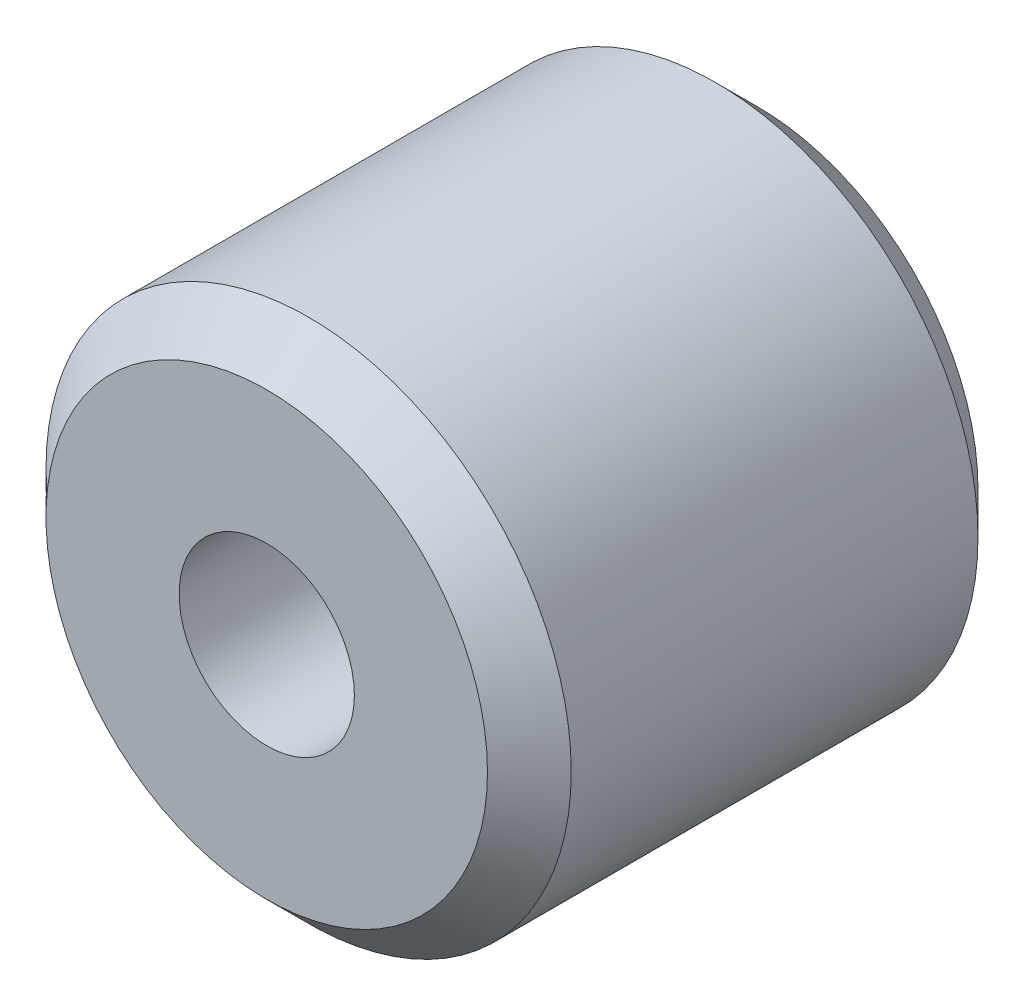
ISO-10303-21;
HEADER;
FILE_DESCRIPTION(('STEP AP214'),'2;1');
FILE_NAME('part.step','',(''),(''),'','','');
FILE_SCHEMA(('AUTOMOTIVE_DESIGN { 1 0 10303 214 1 1 1 1 }'));
ENDSEC;
DATA;
#1=APPLICATION_CONTEXT('core data for automotive mechanical design processes');
#2=APPLICATION_PROTOCOL_DEFINITION('international standard','automotive_design',2000,#1);
#3=PRODUCT_CONTEXT('',#1,'mechanical');
#4=PRODUCT('Part','Part','',(#3));
#5=PRODUCT_RELATED_PRODUCT_CATEGORY('part','',(#4));
#6=PRODUCT_DEFINITION_FORMATION('','',#4);
#7=PRODUCT_DEFINITION_CONTEXT('part definition',#1,'design');
#8=PRODUCT_DEFINITION('design','',#6,#7);
#9=PRODUCT_DEFINITION_SHAPE('','',#8);
#10=(LENGTH_UNIT() NAMED_UNIT(*) SI_UNIT(.MILLI.,.METRE.));
#11=(NAMED_UNIT(*) PLANE_ANGLE_UNIT() SI_UNIT($,.RADIAN.));
#12=(NAMED_UNIT(*) SI_UNIT($,.STERADIAN.) SOLID_ANGLE_UNIT());
#13=UNCERTAINTY_MEASURE_WITH_UNIT(LENGTH_MEASURE(1.E-05),#10,'distance_accuracy_value','');
#14=(GEOMETRIC_REPRESENTATION_CONTEXT(3) GLOBAL_UNCERTAINTY_ASSIGNED_CONTEXT((#13)) GLOBAL_UNIT_ASSIGNED_CONTEXT((#10,
#11,#12)) REPRESENTATION_CONTEXT('',''));
#15=CARTESIAN_POINT('',(0.,0.,0.));
#16=DIRECTION('',(0.,0.,1.));
#17=DIRECTION('',(1.,0.,0.));
#18=AXIS2_PLACEMENT_3D('',#15,#16,#17);
#19=CARTESIAN_POINT('',(0.,0.,4.45));
#20=DIRECTION('',(0.,0.,1.));
#21=DIRECTION('',(1.,0.,0.));
#22=AXIS2_PLACEMENT_3D('',#19,#20,#21);
#23=PLANE('',#22);
#24=CARTESIAN_POINT('',(0.,0.,4.45));
#25=DIRECTION('',(0.,0.,1.));
#26=DIRECTION('',(1.,0.,0.));
#27=AXIS2_PLACEMENT_3D('',#24,#25,#26);
#28=CIRCLE('',#27,4.005);
#29=CARTESIAN_POINT('',(4.005,0.,4.45));
#30=VERTEX_POINT('',#29);
#31=EDGE_CURVE('E10',#30,#30,#28,.T.);
#32=ORIENTED_EDGE('',*,*,#31,.T.);
#33=EDGE_LOOP('',(#32));
#34=FACE_BOUND('',#33,.T.);
#35=CARTESIAN_POINT('',(0.,0.,4.45));
#36=DIRECTION('',(0.,0.,1.));
#37=DIRECTION('',(1.,0.,0.));
#38=AXIS2_PLACEMENT_3D('',#35,#36,#37);
#39=CIRCLE('',#38,1.59);
#40=CARTESIAN_POINT('',(1.59,0.,4.45));
#41=VERTEX_POINT('',#40);
#42=EDGE_CURVE('E53',#41,#41,#39,.T.);
#43=ORIENTED_EDGE('',*,*,#42,.F.);
#44=EDGE_LOOP('',(#43));
#45=FACE_BOUND('',#44,.T.);
#46=ADVANCED_FACE('F32',(#34,#45),#23,.T.);
#47=CARTESIAN_POINT('',(0.,0.,-4.45));
#48=DIRECTION('',(0.,0.,1.));
#49=DIRECTION('',(1.,0.,0.));
#50=AXIS2_PLACEMENT_3D('',#47,#48,#49);
#51=PLANE('',#50);
#52=CARTESIAN_POINT('',(0.,0.,-4.45));
#53=DIRECTION('',(0.,0.,1.));
#54=DIRECTION('',(1.,0.,0.));
#55=AXIS2_PLACEMENT_3D('',#52,#53,#54);
#56=CIRCLE('',#55,4.005);
#57=CARTESIAN_POINT('',(4.005,0.,-4.45));
#58=VERTEX_POINT('',#57);
#59=EDGE_CURVE('E40',#58,#58,#56,.F.);
#60=ORIENTED_EDGE('',*,*,#59,.T.);
#61=EDGE_LOOP('',(#60));
#62=FACE_BOUND('',#61,.T.);
#63=CARTESIAN_POINT('',(0.,0.,-4.45));
#64=DIRECTION('',(0.,0.,1.));
#65=DIRECTION('',(1.,0.,0.));
#66=AXIS2_PLACEMENT_3D('',#63,#64,#65);
#67=CIRCLE('',#66,1.59);
#68=CARTESIAN_POINT('',(1.59,0.,-4.45));
#69=VERTEX_POINT('',#68);
#70=EDGE_CURVE('E54',#69,#69,#67,.T.);
#71=ORIENTED_EDGE('',*,*,#70,.T.);
#72=EDGE_LOOP('',(#71));
#73=FACE_BOUND('',#72,.T.);
#74=ADVANCED_FACE('F64',(#62,#73),#51,.F.);
#75=CARTESIAN_POINT('',(0.,0.,4.45));
#76=DIRECTION('',(0.,0.,-1.));
#77=DIRECTION('',(-1.,0.,0.));
#78=AXIS2_PLACEMENT_3D('',#75,#76,#77);
#79=CYLINDRICAL_SURFACE('',#78,4.765);
#80=CARTESIAN_POINT('',(0.,0.,-3.69));
#81=DIRECTION('',(0.,0.,1.));
#82=DIRECTION('',(1.,0.,0.));
#83=AXIS2_PLACEMENT_3D('',#80,#81,#82);
#84=CIRCLE('',#83,4.765);
#85=CARTESIAN_POINT('',(4.765,0.,-3.69));
#86=VERTEX_POINT('',#85);
#87=EDGE_CURVE('E44',#86,#86,#84,.T.);
#88=ORIENTED_EDGE('',*,*,#87,.T.);
#89=EDGE_LOOP('',(#88));
#90=FACE_BOUND('',#89,.T.);
#91=CARTESIAN_POINT('',(0.,0.,3.69));
#92=DIRECTION('',(0.,0.,1.));
#93=DIRECTION('',(1.,0.,0.));
#94=AXIS2_PLACEMENT_3D('',#91,#92,#93);
#95=CIRCLE('',#94,4.765);
#96=CARTESIAN_POINT('',(4.765,0.,3.69));
#97=VERTEX_POINT('',#96);
#98=EDGE_CURVE('E48',#97,#97,#95,.F.);
#99=ORIENTED_EDGE('',*,*,#98,.T.);
#100=EDGE_LOOP('',(#99));
#101=FACE_BOUND('',#100,.T.);
#102=ADVANCED_FACE('F69',(#90,#101),#79,.T.);
#103=CARTESIAN_POINT('',(0.,0.,4.45));
#104=DIRECTION('',(0.,0.,-1.));
#105=DIRECTION('',(-1.,0.,0.));
#106=AXIS2_PLACEMENT_3D('',#103,#104,#105);
#107=CYLINDRICAL_SURFACE('',#106,1.59);
#108=ORIENTED_EDGE('',*,*,#42,.T.);
#109=EDGE_LOOP('',(#108));
#110=FACE_BOUND('',#109,.T.);
#111=ORIENTED_EDGE('',*,*,#70,.F.);
#112=EDGE_LOOP('',(#111));
#113=FACE_BOUND('',#112,.T.);
#114=ADVANCED_FACE('F60',(#110,#113),#107,.F.);
#115=CARTESIAN_POINT('',(0.,0.,-3.69));
#116=DIRECTION('',(0.,0.,1.));
#117=DIRECTION('',(1.,0.,0.));
#118=AXIS2_PLACEMENT_3D('',#115,#116,#117);
#119=CONICAL_SURFACE('',#118,4.765,0.785398163397448);
#120=CARTESIAN_POINT('',(4.005,0.,-4.45));
#121=CARTESIAN_POINT('',(4.01291666666666,0.,-4.44208333333333));
#122=CARTESIAN_POINT('',(4.02083333333333,0.,-4.43416666666667));
#123=CARTESIAN_POINT('',(4.03666666666666,0.,-4.41833333333333));
#124=CARTESIAN_POINT('',(4.04458333333333,0.,-4.41041666666667));
#125=CARTESIAN_POINT('',(4.06041666666666,0.,-4.39458333333333));
#126=CARTESIAN_POINT('',(4.06833333333333,0.,-4.38666666666667));
#127=CARTESIAN_POINT('',(4.08416666666666,0.,-4.37083333333333));
#128=CARTESIAN_POINT('',(4.09208333333333,0.,-4.36291666666667));
#129=CARTESIAN_POINT('',(4.10791666666666,0.,-4.34708333333333));
#130=CARTESIAN_POINT('',(4.11583333333333,0.,-4.33916666666667));
#131=CARTESIAN_POINT('',(4.13166666666666,0.,-4.32333333333333));
#132=CARTESIAN_POINT('',(4.13958333333333,0.,-4.31541666666667));
#133=CARTESIAN_POINT('',(4.15541666666666,0.,-4.29958333333333));
#134=CARTESIAN_POINT('',(4.16333333333333,0.,-4.29166666666667));
#135=CARTESIAN_POINT('',(4.17916666666666,0.,-4.27583333333333));
#136=CARTESIAN_POINT('',(4.18708333333333,0.,-4.26791666666667));
#137=CARTESIAN_POINT('',(4.20291666666666,0.,-4.25208333333333));
#138=CARTESIAN_POINT('',(4.21083333333333,0.,-4.24416666666667));
#139=CARTESIAN_POINT('',(4.22666666666666,0.,-4.22833333333333));
#140=CARTESIAN_POINT('',(4.23458333333333,0.,-4.22041666666667));
#141=CARTESIAN_POINT('',(4.25041666666666,0.,-4.20458333333333));
#142=CARTESIAN_POINT('',(4.25833333333333,0.,-4.19666666666667));
#143=CARTESIAN_POINT('',(4.27416666666666,0.,-4.18083333333333));
#144=CARTESIAN_POINT('',(4.28208333333333,0.,-4.17291666666667));
#145=CARTESIAN_POINT('',(4.29791666666666,0.,-4.15708333333333));
#146=CARTESIAN_POINT('',(4.30583333333333,0.,-4.14916666666667));
#147=CARTESIAN_POINT('',(4.32166666666666,0.,-4.13333333333333));
#148=CARTESIAN_POINT('',(4.32958333333333,0.,-4.12541666666667));
#149=CARTESIAN_POINT('',(4.34541666666666,0.,-4.10958333333333));
#150=CARTESIAN_POINT('',(4.35333333333333,0.,-4.10166666666667));
#151=CARTESIAN_POINT('',(4.36916666666666,0.,-4.08583333333333));
#152=CARTESIAN_POINT('',(4.37708333333333,0.,-4.07791666666667));
#153=CARTESIAN_POINT('',(4.39291666666666,0.,-4.06208333333333));
#154=CARTESIAN_POINT('',(4.40083333333333,0.,-4.05416666666667));
#155=CARTESIAN_POINT('',(4.41666666666666,0.,-4.03833333333333));
#156=CARTESIAN_POINT('',(4.42458333333333,0.,-4.03041666666667));
#157=CARTESIAN_POINT('',(4.44041666666666,0.,-4.01458333333333));
#158=CARTESIAN_POINT('',(4.44833333333333,0.,-4.00666666666667));
#159=CARTESIAN_POINT('',(4.46416666666666,0.,-3.99083333333333));
#160=CARTESIAN_POINT('',(4.47208333333333,0.,-3.98291666666667));
#161=CARTESIAN_POINT('',(4.48791666666666,0.,-3.96708333333333));
#162=CARTESIAN_POINT('',(4.49583333333333,0.,-3.95916666666667));
#163=CARTESIAN_POINT('',(4.51166666666666,0.,-3.94333333333333));
#164=CARTESIAN_POINT('',(4.51958333333333,0.,-3.93541666666667));
#165=CARTESIAN_POINT('',(4.53541666666666,0.,-3.91958333333333));
#166=CARTESIAN_POINT('',(4.54333333333333,0.,-3.91166666666667));
#167=CARTESIAN_POINT('',(4.55916666666666,0.,-3.89583333333333));
#168=CARTESIAN_POINT('',(4.56708333333333,0.,-3.88791666666667));
#169=CARTESIAN_POINT('',(4.58291666666666,0.,-3.87208333333333));
#170=CARTESIAN_POINT('',(4.59083333333333,0.,-3.86416666666666));
#171=CARTESIAN_POINT('',(4.60666666666667,0.,-3.84833333333333));
#172=CARTESIAN_POINT('',(4.61458333333333,0.,-3.84041666666667));
#173=CARTESIAN_POINT('',(4.63041666666667,0.,-3.82458333333333));
#174=CARTESIAN_POINT('',(4.63833333333333,0.,-3.81666666666667));
#175=CARTESIAN_POINT('',(4.65416666666667,0.,-3.80083333333333));
#176=CARTESIAN_POINT('',(4.66208333333333,0.,-3.79291666666666));
#177=CARTESIAN_POINT('',(4.67791666666667,0.,-3.77708333333333));
#178=CARTESIAN_POINT('',(4.68583333333333,0.,-3.76916666666667));
#179=CARTESIAN_POINT('',(4.70166666666667,0.,-3.75333333333333));
#180=CARTESIAN_POINT('',(4.70958333333333,0.,-3.74541666666666));
#181=CARTESIAN_POINT('',(4.72541666666667,0.,-3.72958333333333));
#182=CARTESIAN_POINT('',(4.73333333333333,0.,-3.72166666666666));
#183=CARTESIAN_POINT('',(4.74916666666667,0.,-3.70583333333333));
#184=CARTESIAN_POINT('',(4.75708333333333,0.,-3.69791666666666));
#185=CARTESIAN_POINT('',(4.765,0.,-3.69));
#186=B_SPLINE_CURVE_WITH_KNOTS('',3,(#120,#121,#122,#123,#124,#125,#126,#127,#128,#129,#130,
#131,#132,#133,#134,#135,#136,#137,#138,#139,#140,#141,#142,#143,#144,#145,#146,#147,#148,#149,
#150,#151,#152,#153,#154,#155,#156,#157,#158,#159,#160,#161,#162,#163,#164,#165,#166,#167,#168,
#169,#170,#171,#172,#173,#174,#175,#176,#177,#178,#179,#180,#181,#182,#183,#184,#185),
.UNSPECIFIED.,.F.,.F.,(4,2,2,2,2,2,2,2,2,2,2,2,2,2,2,2,2,2,2,2,2,2,2,2,2,2,2,2,2,2,2,2,4),(0.,
0.0335875721063609,0.0671751442127223,0.100762716319084,0.134350288425444,0.167937860531806,
0.201525432638167,0.235113004744528,0.268700576850889,0.30228814895725,0.335875721063612,
0.369463293169972,0.403050865276333,0.436638437382695,0.470226009489055,0.503813581595417,
0.537401153701778,0.570988725808138,0.6045762979145,0.638163870020861,0.671751442127222,
0.705339014233583,0.738926586339945,0.772514158446305,0.806101730552667,0.839689302659028,
0.873276874765389,0.90686444687175,0.940452018978111,0.974039591084472,1.00762716319083,
1.04121473529719,1.07480230740356),.UNSPECIFIED.);
#187=EDGE_CURVE('BSEAM76',#58,#86,#186,.T.);
#188=ORIENTED_EDGE('',*,*,#59,.F.);
#189=ORIENTED_EDGE('',*,*,#87,.F.);
#190=ORIENTED_EDGE('',*,*,#187,.T.);
#191=ORIENTED_EDGE('',*,*,#187,.F.);
#192=EDGE_LOOP('',(#188,#190,#189,#191));
#193=FACE_BOUND('',#192,.T.);
#194=ADVANCED_FACE('F76',(#193),#119,.T.);
#195=CARTESIAN_POINT('',(0.,0.,4.45));
#196=DIRECTION('',(0.,0.,-1.));
#197=DIRECTION('',(-1.,0.,0.));
#198=AXIS2_PLACEMENT_3D('',#195,#196,#197);
#199=CONICAL_SURFACE('',#198,4.005,0.785398163397449);
#200=ORIENTED_EDGE('',*,*,#98,.F.);
#201=EDGE_LOOP('',(#200));
#202=FACE_BOUND('',#201,.T.);
#203=ORIENTED_EDGE('',*,*,#31,.F.);
#204=EDGE_LOOP('',(#203));
#205=FACE_BOUND('',#204,.T.);
#206=ADVANCED_FACE('F35',(#202,#205),#199,.T.);
#207=CLOSED_SHELL('',(#46,#74,#102,#114,#194,#206));
#208=MANIFOLD_SOLID_BREP('B2',#207);
#209=ADVANCED_BREP_SHAPE_REPRESENTATION('',(#18,#208),#14);
#210=SHAPE_DEFINITION_REPRESENTATION(#9,#209);
ENDSEC;
END-ISO-10303-21;
